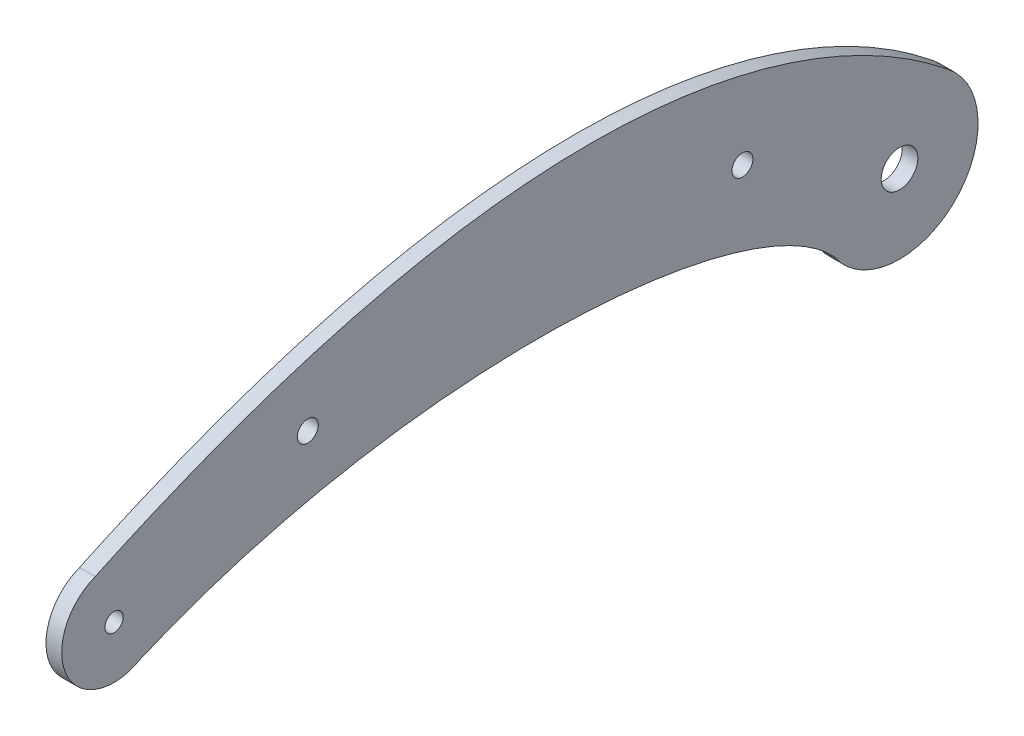
ISO-10303-21;
HEADER;
FILE_DESCRIPTION(('STEP AP214'),'2;1');
FILE_NAME('part.step','',(''),(''),'','','');
FILE_SCHEMA(('AUTOMOTIVE_DESIGN { 1 0 10303 214 1 1 1 1 }'));
ENDSEC;
DATA;
#1=APPLICATION_CONTEXT('core data for automotive mechanical design processes');
#2=APPLICATION_PROTOCOL_DEFINITION('international standard','automotive_design',2000,#1);
#3=PRODUCT_CONTEXT('',#1,'mechanical');
#4=PRODUCT('Part','Part','',(#3));
#5=PRODUCT_RELATED_PRODUCT_CATEGORY('part','',(#4));
#6=PRODUCT_DEFINITION_FORMATION('','',#4);
#7=PRODUCT_DEFINITION_CONTEXT('part definition',#1,'design');
#8=PRODUCT_DEFINITION('design','',#6,#7);
#9=PRODUCT_DEFINITION_SHAPE('','',#8);
#10=(LENGTH_UNIT() NAMED_UNIT(*) SI_UNIT(.MILLI.,.METRE.));
#11=(NAMED_UNIT(*) PLANE_ANGLE_UNIT() SI_UNIT($,.RADIAN.));
#12=(NAMED_UNIT(*) SI_UNIT($,.STERADIAN.) SOLID_ANGLE_UNIT());
#13=UNCERTAINTY_MEASURE_WITH_UNIT(LENGTH_MEASURE(1.E-05),#10,'distance_accuracy_value','');
#14=(GEOMETRIC_REPRESENTATION_CONTEXT(3) GLOBAL_UNCERTAINTY_ASSIGNED_CONTEXT((#13)) GLOBAL_UNIT_ASSIGNED_CONTEXT((#10,
#11,#12)) REPRESENTATION_CONTEXT('',''));
#15=CARTESIAN_POINT('',(0.,0.,0.));
#16=DIRECTION('',(0.,0.,1.));
#17=DIRECTION('',(1.,0.,0.));
#18=AXIS2_PLACEMENT_3D('',#15,#16,#17);
#19=CARTESIAN_POINT('',(3.,6.39651471446297,65.9547983464172));
#20=DIRECTION('',(1.,0.,0.));
#21=DIRECTION('',(0.,0.,-1.));
#22=AXIS2_PLACEMENT_3D('',#19,#20,#21);
#23=PLANE('',#22);
#24=CARTESIAN_POINT('',(3.,13.1171799999505,113.));
#25=DIRECTION('',(1.,0.,0.));
#26=DIRECTION('',(0.,0.,-1.));
#27=AXIS2_PLACEMENT_3D('',#24,#25,#26);
#28=CIRCLE('',#27,2.);
#29=CARTESIAN_POINT('',(3.,13.1171799999505,111.));
#30=VERTEX_POINT('',#29);
#31=EDGE_CURVE('E152',#30,#30,#28,.T.);
#32=ORIENTED_EDGE('',*,*,#31,.F.);
#33=EDGE_LOOP('',(#32));
#34=FACE_BOUND('',#33,.T.);
#35=CARTESIAN_POINT('',(3.,0.,0.));
#36=DIRECTION('',(1.,0.,0.));
#37=DIRECTION('',(0.,0.,-1.));
#38=AXIS2_PLACEMENT_3D('',#35,#36,#37);
#39=CIRCLE('',#38,3.5);
#40=CARTESIAN_POINT('',(3.,0.,-3.5));
#41=VERTEX_POINT('',#40);
#42=EDGE_CURVE('E164',#41,#41,#39,.T.);
#43=ORIENTED_EDGE('',*,*,#42,.F.);
#44=EDGE_LOOP('',(#43));
#45=FACE_BOUND('',#44,.T.);
#46=CARTESIAN_POINT('',(3.,-8.59851876654942,144.89456416931));
#47=CARTESIAN_POINT('',(3.,13.0893357463916,94.3995636790345));
#48=CARTESIAN_POINT('',(3.,9.60820748675708,29.0217902647538));
#49=CARTESIAN_POINT('',(3.,-8.32199321719293,12.4797607706636));
#50=B_SPLINE_CURVE_WITH_KNOTS('',3,(#46,#47,#48,#49),.UNSPECIFIED.,.F.,.F.,(4,4),(0.,1.),.UNSPECIFIED.);
#51=CARTESIAN_POINT('',(3.,-8.59851876654942,144.89456416931));
#52=VERTEX_POINT('',#51);
#53=CARTESIAN_POINT('',(3.,-8.32199321719289,12.4797607706637));
#54=VERTEX_POINT('',#53);
#55=EDGE_CURVE('E85',#52,#54,#50,.T.);
#56=ORIENTED_EDGE('',*,*,#55,.T.);
#57=CARTESIAN_POINT('',(3.,0.,0.));
#58=DIRECTION('',(1.,0.,0.));
#59=DIRECTION('',(0.,0.,-1.));
#60=AXIS2_PLACEMENT_3D('',#57,#58,#59);
#61=CIRCLE('',#60,15.);
#62=CARTESIAN_POINT('',(3.,11.7832674671061,-9.28195064620789));
#63=VERTEX_POINT('',#62);
#64=EDGE_CURVE('E80',#54,#63,#61,.T.);
#65=ORIENTED_EDGE('',*,*,#64,.T.);
#66=CARTESIAN_POINT('',(3.,11.7832674671061,-9.28195064620791));
#67=CARTESIAN_POINT('',(3.,21.6661173857813,3.02868552316829));
#68=CARTESIAN_POINT('',(3.,57.0174540483026,52.0274645532871));
#69=CARTESIAN_POINT('',(3.,9.33360602277759,153.589400870838));
#70=B_SPLINE_CURVE_WITH_KNOTS('',3,(#66,#67,#68,#69),.UNSPECIFIED.,.F.,.F.,(4,4),(0.,1.),.UNSPECIFIED.);
#71=CARTESIAN_POINT('',(3.,9.33360602277759,153.589400870838));
#72=VERTEX_POINT('',#71);
#73=EDGE_CURVE('E83',#63,#72,#70,.T.);
#74=ORIENTED_EDGE('',*,*,#73,.T.);
#75=CARTESIAN_POINT('',(3.,0.,150.));
#76=DIRECTION('',(1.,0.,0.));
#77=DIRECTION('',(0.,0.,-1.));
#78=AXIS2_PLACEMENT_3D('',#75,#76,#77);
#79=CIRCLE('',#78,10.);
#80=EDGE_CURVE('E50',#72,#52,#79,.T.);
#81=ORIENTED_EDGE('',*,*,#80,.T.);
#82=EDGE_LOOP('',(#56,#65,#74,#81));
#83=FACE_BOUND('',#82,.T.);
#84=CARTESIAN_POINT('',(3.,0.,150.));
#85=DIRECTION('',(1.,0.,0.));
#86=DIRECTION('',(0.,0.,-1.));
#87=AXIS2_PLACEMENT_3D('',#84,#85,#86);
#88=CIRCLE('',#87,1.75000000000001);
#89=CARTESIAN_POINT('',(3.,0.,148.25));
#90=VERTEX_POINT('',#89);
#91=EDGE_CURVE('E158',#90,#90,#88,.T.);
#92=ORIENTED_EDGE('',*,*,#91,.F.);
#93=EDGE_LOOP('',(#92));
#94=FACE_BOUND('',#93,.T.);
#95=CARTESIAN_POINT('',(3.,15.6147810456113,30.));
#96=DIRECTION('',(1.,0.,0.));
#97=DIRECTION('',(0.,0.,-1.));
#98=AXIS2_PLACEMENT_3D('',#95,#96,#97);
#99=CIRCLE('',#98,2.);
#100=CARTESIAN_POINT('',(3.,15.6147810456113,28.));
#101=VERTEX_POINT('',#100);
#102=EDGE_CURVE('E143',#101,#101,#99,.T.);
#103=ORIENTED_EDGE('',*,*,#102,.F.);
#104=EDGE_LOOP('',(#103));
#105=FACE_BOUND('',#104,.T.);
#106=ADVANCED_FACE('F32',(#34,#45,#83,#94,#105),#23,.T.);
#107=CARTESIAN_POINT('',(0.,6.39651471446297,65.9547983464172));
#108=DIRECTION('',(1.,0.,0.));
#109=DIRECTION('',(0.,0.,-1.));
#110=AXIS2_PLACEMENT_3D('',#107,#108,#109);
#111=PLANE('',#110);
#112=CARTESIAN_POINT('',(0.,13.1171799999505,113.));
#113=DIRECTION('',(1.,0.,0.));
#114=DIRECTION('',(0.,0.,-1.));
#115=AXIS2_PLACEMENT_3D('',#112,#113,#114);
#116=CIRCLE('',#115,2.);
#117=CARTESIAN_POINT('',(0.,13.1171799999505,111.));
#118=VERTEX_POINT('',#117);
#119=EDGE_CURVE('E149',#118,#118,#116,.T.);
#120=ORIENTED_EDGE('',*,*,#119,.T.);
#121=EDGE_LOOP('',(#120));
#122=FACE_BOUND('',#121,.T.);
#123=CARTESIAN_POINT('',(0.,0.,0.));
#124=DIRECTION('',(1.,0.,0.));
#125=DIRECTION('',(0.,0.,-1.));
#126=AXIS2_PLACEMENT_3D('',#123,#124,#125);
#127=CIRCLE('',#126,3.5);
#128=CARTESIAN_POINT('',(0.,0.,-3.5));
#129=VERTEX_POINT('',#128);
#130=EDGE_CURVE('E161',#129,#129,#127,.T.);
#131=ORIENTED_EDGE('',*,*,#130,.T.);
#132=EDGE_LOOP('',(#131));
#133=FACE_BOUND('',#132,.T.);
#134=CARTESIAN_POINT('',(0.,-8.59851876654942,144.89456416931));
#135=CARTESIAN_POINT('',(0.,13.0893357463916,94.3995636790345));
#136=CARTESIAN_POINT('',(0.,9.60820748675708,29.0217902647538));
#137=CARTESIAN_POINT('',(0.,-8.32199321719293,12.4797607706636));
#138=B_SPLINE_CURVE_WITH_KNOTS('',3,(#134,#135,#136,#137),.UNSPECIFIED.,.F.,.F.,(4,4),(0.,1.),.UNSPECIFIED.);
#139=CARTESIAN_POINT('',(0.,-8.59851876654942,144.89456416931));
#140=VERTEX_POINT('',#139);
#141=CARTESIAN_POINT('',(0.,-8.32199321719289,12.4797607706637));
#142=VERTEX_POINT('',#141);
#143=EDGE_CURVE('E167',#140,#142,#138,.T.);
#144=ORIENTED_EDGE('',*,*,#143,.F.);
#145=CARTESIAN_POINT('',(0.,0.,150.));
#146=DIRECTION('',(1.,0.,0.));
#147=DIRECTION('',(0.,0.,-1.));
#148=AXIS2_PLACEMENT_3D('',#145,#146,#147);
#149=CIRCLE('',#148,10.);
#150=CARTESIAN_POINT('',(0.,9.33360602277759,153.589400870838));
#151=VERTEX_POINT('',#150);
#152=EDGE_CURVE('E73',#151,#140,#149,.T.);
#153=ORIENTED_EDGE('',*,*,#152,.F.);
#154=CARTESIAN_POINT('',(0.,11.7832674671061,-9.28195064620791));
#155=CARTESIAN_POINT('',(0.,21.6661173857813,3.02868552316829));
#156=CARTESIAN_POINT('',(0.,57.0174540483026,52.0274645532871));
#157=CARTESIAN_POINT('',(0.,9.33360602277759,153.589400870838));
#158=B_SPLINE_CURVE_WITH_KNOTS('',3,(#154,#155,#156,#157),.UNSPECIFIED.,.F.,.F.,(4,4),(0.,1.),.UNSPECIFIED.);
#159=CARTESIAN_POINT('',(0.,11.7832674671061,-9.28195064620789));
#160=VERTEX_POINT('',#159);
#161=EDGE_CURVE('E67',#160,#151,#158,.T.);
#162=ORIENTED_EDGE('',*,*,#161,.F.);
#163=CARTESIAN_POINT('',(0.,0.,0.));
#164=DIRECTION('',(1.,0.,0.));
#165=DIRECTION('',(0.,0.,-1.));
#166=AXIS2_PLACEMENT_3D('',#163,#164,#165);
#167=CIRCLE('',#166,15.);
#168=EDGE_CURVE('E89',#142,#160,#167,.T.);
#169=ORIENTED_EDGE('',*,*,#168,.F.);
#170=EDGE_LOOP('',(#144,#153,#162,#169));
#171=FACE_BOUND('',#170,.T.);
#172=CARTESIAN_POINT('',(0.,0.,150.));
#173=DIRECTION('',(1.,0.,0.));
#174=DIRECTION('',(0.,0.,-1.));
#175=AXIS2_PLACEMENT_3D('',#172,#173,#174);
#176=CIRCLE('',#175,1.75000000000001);
#177=CARTESIAN_POINT('',(0.,0.,148.25));
#178=VERTEX_POINT('',#177);
#179=EDGE_CURVE('E155',#178,#178,#176,.T.);
#180=ORIENTED_EDGE('',*,*,#179,.T.);
#181=EDGE_LOOP('',(#180));
#182=FACE_BOUND('',#181,.T.);
#183=CARTESIAN_POINT('',(0.,15.6147810456113,30.));
#184=DIRECTION('',(1.,0.,0.));
#185=DIRECTION('',(0.,0.,-1.));
#186=AXIS2_PLACEMENT_3D('',#183,#184,#185);
#187=CIRCLE('',#186,2.);
#188=CARTESIAN_POINT('',(0.,15.6147810456113,28.));
#189=VERTEX_POINT('',#188);
#190=EDGE_CURVE('E146',#189,#189,#187,.T.);
#191=ORIENTED_EDGE('',*,*,#190,.T.);
#192=EDGE_LOOP('',(#191));
#193=FACE_BOUND('',#192,.T.);
#194=ADVANCED_FACE('F111',(#122,#133,#171,#182,#193),#111,.F.);
#195=DIRECTION('',(-1.,0.,0.));
#196=VECTOR('',#195,1.);
#197=SURFACE_OF_LINEAR_EXTRUSION('',#50,#196);
#198=ORIENTED_EDGE('',*,*,#143,.T.);
#199=DIRECTION('',(-1.,0.,0.));
#200=VECTOR('',#199,1.);
#201=CARTESIAN_POINT('',(3.,-8.32199321719289,12.4797607706637));
#202=LINE('',#201,#200);
#203=EDGE_CURVE('E11',#54,#142,#202,.T.);
#204=ORIENTED_EDGE('',*,*,#203,.F.);
#205=ORIENTED_EDGE('',*,*,#55,.F.);
#206=DIRECTION('',(-1.,0.,0.));
#207=VECTOR('',#206,1.);
#208=CARTESIAN_POINT('',(3.,-8.59851876654942,144.89456416931));
#209=LINE('',#208,#207);
#210=EDGE_CURVE('E93',#52,#140,#209,.T.);
#211=ORIENTED_EDGE('',*,*,#210,.T.);
#212=EDGE_LOOP('',(#198,#204,#205,#211));
#213=FACE_BOUND('',#212,.T.);
#214=ADVANCED_FACE('F34',(#213),#197,.F.);
#215=CARTESIAN_POINT('',(3.,0.,0.));
#216=DIRECTION('',(-1.,0.,0.));
#217=DIRECTION('',(0.,0.,1.));
#218=AXIS2_PLACEMENT_3D('',#215,#216,#217);
#219=CYLINDRICAL_SURFACE('',#218,15.);
#220=ORIENTED_EDGE('',*,*,#168,.T.);
#221=DIRECTION('',(-1.,0.,0.));
#222=VECTOR('',#221,1.);
#223=CARTESIAN_POINT('',(3.,11.7832674671061,-9.28195064620789));
#224=LINE('',#223,#222);
#225=EDGE_CURVE('E42',#63,#160,#224,.T.);
#226=ORIENTED_EDGE('',*,*,#225,.F.);
#227=ORIENTED_EDGE('',*,*,#64,.F.);
#228=ORIENTED_EDGE('',*,*,#203,.T.);
#229=EDGE_LOOP('',(#220,#226,#227,#228));
#230=FACE_BOUND('',#229,.T.);
#231=ADVANCED_FACE('F88',(#230),#219,.T.);
#232=DIRECTION('',(-1.,0.,0.));
#233=VECTOR('',#232,1.);
#234=SURFACE_OF_LINEAR_EXTRUSION('',#70,#233);
#235=ORIENTED_EDGE('',*,*,#161,.T.);
#236=DIRECTION('',(-1.,0.,0.));
#237=VECTOR('',#236,1.);
#238=CARTESIAN_POINT('',(3.,9.33360602277759,153.589400870838));
#239=LINE('',#238,#237);
#240=EDGE_CURVE('E90',#72,#151,#239,.T.);
#241=ORIENTED_EDGE('',*,*,#240,.F.);
#242=ORIENTED_EDGE('',*,*,#73,.F.);
#243=ORIENTED_EDGE('',*,*,#225,.T.);
#244=EDGE_LOOP('',(#235,#241,#242,#243));
#245=FACE_BOUND('',#244,.T.);
#246=ADVANCED_FACE('F91',(#245),#234,.F.);
#247=CARTESIAN_POINT('',(3.,0.,150.));
#248=DIRECTION('',(-1.,0.,0.));
#249=DIRECTION('',(0.,0.,1.));
#250=AXIS2_PLACEMENT_3D('',#247,#248,#249);
#251=CYLINDRICAL_SURFACE('',#250,10.);
#252=ORIENTED_EDGE('',*,*,#152,.T.);
#253=ORIENTED_EDGE('',*,*,#210,.F.);
#254=ORIENTED_EDGE('',*,*,#80,.F.);
#255=ORIENTED_EDGE('',*,*,#240,.T.);
#256=EDGE_LOOP('',(#252,#253,#254,#255));
#257=FACE_BOUND('',#256,.T.);
#258=ADVANCED_FACE('F105',(#257),#251,.T.);
#259=CARTESIAN_POINT('',(3.,0.,0.));
#260=DIRECTION('',(-1.,0.,0.));
#261=DIRECTION('',(0.,0.,1.));
#262=AXIS2_PLACEMENT_3D('',#259,#260,#261);
#263=CYLINDRICAL_SURFACE('',#262,3.5);
#264=ORIENTED_EDGE('',*,*,#42,.T.);
#265=EDGE_LOOP('',(#264));
#266=FACE_BOUND('',#265,.T.);
#267=ORIENTED_EDGE('',*,*,#130,.F.);
#268=EDGE_LOOP('',(#267));
#269=FACE_BOUND('',#268,.T.);
#270=ADVANCED_FACE('F123',(#266,#269),#263,.F.);
#271=CARTESIAN_POINT('',(3.,0.,150.));
#272=DIRECTION('',(-1.,0.,0.));
#273=DIRECTION('',(0.,0.,1.));
#274=AXIS2_PLACEMENT_3D('',#271,#272,#273);
#275=CYLINDRICAL_SURFACE('',#274,1.75000000000001);
#276=ORIENTED_EDGE('',*,*,#91,.T.);
#277=EDGE_LOOP('',(#276));
#278=FACE_BOUND('',#277,.T.);
#279=ORIENTED_EDGE('',*,*,#179,.F.);
#280=EDGE_LOOP('',(#279));
#281=FACE_BOUND('',#280,.T.);
#282=ADVANCED_FACE('F126',(#278,#281),#275,.F.);
#283=CARTESIAN_POINT('',(3.,13.1171799999505,113.));
#284=DIRECTION('',(-1.,0.,0.));
#285=DIRECTION('',(0.,0.,1.));
#286=AXIS2_PLACEMENT_3D('',#283,#284,#285);
#287=CYLINDRICAL_SURFACE('',#286,2.);
#288=ORIENTED_EDGE('',*,*,#31,.T.);
#289=EDGE_LOOP('',(#288));
#290=FACE_BOUND('',#289,.T.);
#291=ORIENTED_EDGE('',*,*,#119,.F.);
#292=EDGE_LOOP('',(#291));
#293=FACE_BOUND('',#292,.T.);
#294=ADVANCED_FACE('F130',(#290,#293),#287,.F.);
#295=CARTESIAN_POINT('',(3.,15.6147810456113,30.));
#296=DIRECTION('',(-1.,0.,0.));
#297=DIRECTION('',(0.,0.,1.));
#298=AXIS2_PLACEMENT_3D('',#295,#296,#297);
#299=CYLINDRICAL_SURFACE('',#298,2.);
#300=ORIENTED_EDGE('',*,*,#102,.T.);
#301=EDGE_LOOP('',(#300));
#302=FACE_BOUND('',#301,.T.);
#303=ORIENTED_EDGE('',*,*,#190,.F.);
#304=EDGE_LOOP('',(#303));
#305=FACE_BOUND('',#304,.T.);
#306=ADVANCED_FACE('F134',(#302,#305),#299,.F.);
#307=CLOSED_SHELL('',(#106,#194,#214,#231,#246,#258,#270,#282,#294,#306));
#308=MANIFOLD_SOLID_BREP('B2',#307);
#309=ADVANCED_BREP_SHAPE_REPRESENTATION('',(#18,#308),#14);
#310=SHAPE_DEFINITION_REPRESENTATION(#9,#309);
ENDSEC;
END-ISO-10303-21;
